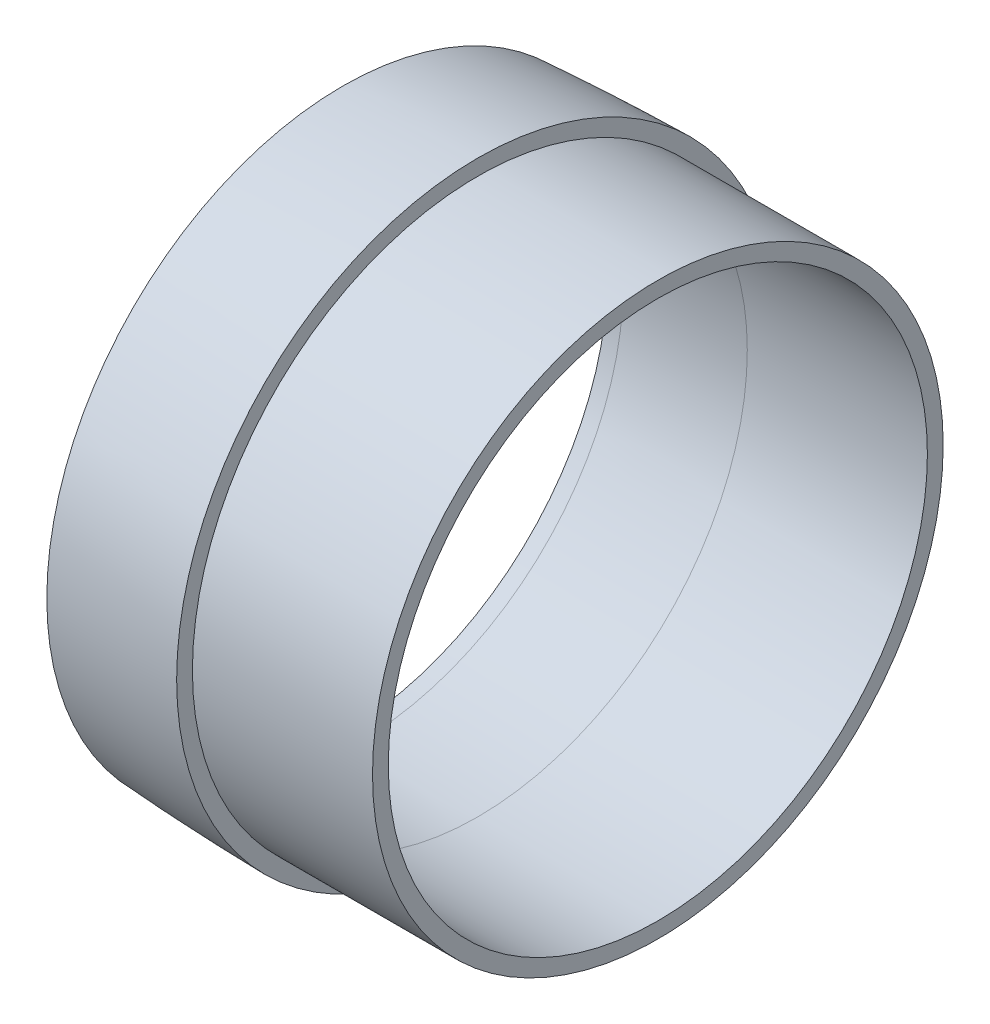
ISO-10303-21;
HEADER;
FILE_DESCRIPTION(('STEP AP214'),'2;1');
FILE_NAME('part.step','',(''),(''),'','','');
FILE_SCHEMA(('AUTOMOTIVE_DESIGN { 1 0 10303 214 1 1 1 1 }'));
ENDSEC;
DATA;
#1=APPLICATION_CONTEXT('core data for automotive mechanical design processes');
#2=APPLICATION_PROTOCOL_DEFINITION('international standard','automotive_design',2000,#1);
#3=PRODUCT_CONTEXT('',#1,'mechanical');
#4=PRODUCT('Part','Part','',(#3));
#5=PRODUCT_RELATED_PRODUCT_CATEGORY('part','',(#4));
#6=PRODUCT_DEFINITION_FORMATION('','',#4);
#7=PRODUCT_DEFINITION_CONTEXT('part definition',#1,'design');
#8=PRODUCT_DEFINITION('design','',#6,#7);
#9=PRODUCT_DEFINITION_SHAPE('','',#8);
#10=(LENGTH_UNIT() NAMED_UNIT(*) SI_UNIT(.MILLI.,.METRE.));
#11=(NAMED_UNIT(*) PLANE_ANGLE_UNIT() SI_UNIT($,.RADIAN.));
#12=(NAMED_UNIT(*) SI_UNIT($,.STERADIAN.) SOLID_ANGLE_UNIT());
#13=UNCERTAINTY_MEASURE_WITH_UNIT(LENGTH_MEASURE(1.E-05),#10,'distance_accuracy_value','');
#14=(GEOMETRIC_REPRESENTATION_CONTEXT(3) GLOBAL_UNCERTAINTY_ASSIGNED_CONTEXT((#13)) GLOBAL_UNIT_ASSIGNED_CONTEXT((#10,
#11,#12)) REPRESENTATION_CONTEXT('',''));
#15=CARTESIAN_POINT('',(0.,0.,0.));
#16=DIRECTION('',(0.,0.,1.));
#17=DIRECTION('',(1.,0.,0.));
#18=AXIS2_PLACEMENT_3D('',#15,#16,#17);
#19=CARTESIAN_POINT('',(185.,0.,0.));
#20=DIRECTION('',(-1.,0.,0.));
#21=DIRECTION('',(0.,0.,1.));
#22=AXIS2_PLACEMENT_3D('',#19,#20,#21);
#23=PLANE('',#22);
#24=CARTESIAN_POINT('',(185.,0.,0.));
#25=DIRECTION('',(-1.,0.,0.));
#26=DIRECTION('',(0.,0.,1.));
#27=AXIS2_PLACEMENT_3D('',#24,#25,#26);
#28=CIRCLE('',#27,29.4153903796707);
#29=CARTESIAN_POINT('',(185.,0.,29.4153903796707));
#30=VERTEX_POINT('',#29);
#31=EDGE_CURVE('E57',#30,#30,#28,.T.);
#32=ORIENTED_EDGE('',*,*,#31,.F.);
#33=EDGE_LOOP('',(#32));
#34=FACE_BOUND('',#33,.T.);
#35=CARTESIAN_POINT('',(185.,0.,0.));
#36=DIRECTION('',(-1.,0.,0.));
#37=DIRECTION('',(0.,0.,1.));
#38=AXIS2_PLACEMENT_3D('',#35,#36,#37);
#39=CIRCLE('',#38,31.0982084339819);
#40=CARTESIAN_POINT('',(185.,0.,31.0982084339819));
#41=VERTEX_POINT('',#40);
#42=EDGE_CURVE('E12',#41,#41,#39,.T.);
#43=ORIENTED_EDGE('',*,*,#42,.T.);
#44=EDGE_LOOP('',(#43));
#45=FACE_BOUND('',#44,.T.);
#46=ADVANCED_FACE('F43',(#34,#45),#23,.T.);
#47=CARTESIAN_POINT('',(185.,0.,0.));
#48=DIRECTION('',(1.,0.,0.));
#49=DIRECTION('',(0.,0.,-1.));
#50=AXIS2_PLACEMENT_3D('',#47,#48,#49);
#51=CONICAL_SURFACE('',#50,31.0982084339819,0.0391359924158488);
#52=CARTESIAN_POINT('',(200.,0.,0.));
#53=DIRECTION('',(1.,0.,0.));
#54=DIRECTION('',(0.,0.,-1.));
#55=AXIS2_PLACEMENT_3D('',#52,#53,#54);
#56=CIRCLE('',#55,31.6855482124485);
#57=CARTESIAN_POINT('',(200.,0.,-31.6855482124485));
#58=VERTEX_POINT('',#57);
#59=EDGE_CURVE('E47',#58,#58,#56,.T.);
#60=ORIENTED_EDGE('',*,*,#59,.F.);
#61=EDGE_LOOP('',(#60));
#62=FACE_BOUND('',#61,.T.);
#63=ORIENTED_EDGE('',*,*,#42,.F.);
#64=EDGE_LOOP('',(#63));
#65=FACE_BOUND('',#64,.T.);
#66=ADVANCED_FACE('F92',(#62,#65),#51,.T.);
#67=CARTESIAN_POINT('',(185.068470505071,0.,0.));
#68=DIRECTION('',(1.,0.,0.));
#69=DIRECTION('',(0.,0.,-1.));
#70=AXIS2_PLACEMENT_3D('',#67,#68,#69);
#71=CONICAL_SURFACE('',#70,29.3495484356016,0.0391359924158488);
#72=CARTESIAN_POINT('',(200.,0.,0.));
#73=DIRECTION('',(1.,0.,0.));
#74=DIRECTION('',(0.,0.,-1.));
#75=AXIS2_PLACEMENT_3D('',#72,#73,#74);
#76=CIRCLE('',#75,29.9342071839829);
#77=CARTESIAN_POINT('',(200.,0.,-29.9342071839829));
#78=VERTEX_POINT('',#77);
#79=EDGE_CURVE('E125',#78,#78,#76,.T.);
#80=ORIENTED_EDGE('',*,*,#79,.T.);
#81=EDGE_LOOP('',(#80));
#82=FACE_BOUND('',#81,.T.);
#83=CARTESIAN_POINT('',(186.75,0.,0.));
#84=DIRECTION('',(1.,0.,0.));
#85=DIRECTION('',(0.,0.,-1.));
#86=AXIS2_PLACEMENT_3D('',#83,#84,#85);
#87=CIRCLE('',#86,29.4153903796707);
#88=CARTESIAN_POINT('',(186.75,0.,-29.4153903796707));
#89=VERTEX_POINT('',#88);
#90=EDGE_CURVE('E66',#89,#89,#87,.T.);
#91=ORIENTED_EDGE('',*,*,#90,.F.);
#92=EDGE_LOOP('',(#91));
#93=FACE_BOUND('',#92,.T.);
#94=ADVANCED_FACE('F89',(#82,#93),#71,.F.);
#95=CARTESIAN_POINT('',(176.75,0.,0.));
#96=DIRECTION('',(1.,0.,0.));
#97=DIRECTION('',(0.,0.,-1.));
#98=AXIS2_PLACEMENT_3D('',#95,#96,#97);
#99=CYLINDRICAL_SURFACE('',#98,29.4153903796707);
#100=ORIENTED_EDGE('',*,*,#31,.T.);
#101=EDGE_LOOP('',(#100));
#102=FACE_BOUND('',#101,.T.);
#103=ORIENTED_EDGE('',*,*,#90,.T.);
#104=EDGE_LOOP('',(#103));
#105=FACE_BOUND('',#104,.T.);
#106=ADVANCED_FACE('F86',(#102,#105),#99,.F.);
#107=CARTESIAN_POINT('',(220.,0.,0.));
#108=DIRECTION('',(1.,0.,0.));
#109=DIRECTION('',(0.,0.,-1.));
#110=AXIS2_PLACEMENT_3D('',#107,#108,#109);
#111=PLANE('',#110);
#112=CARTESIAN_POINT('',(220.,0.,0.));
#113=DIRECTION('',(1.,0.,0.));
#114=DIRECTION('',(0.,0.,-1.));
#115=AXIS2_PLACEMENT_3D('',#112,#113,#114);
#116=CIRCLE('',#115,31.6855482124485);
#117=CARTESIAN_POINT('',(220.,0.,-31.6855482124485));
#118=VERTEX_POINT('',#117);
#119=EDGE_CURVE('E121',#118,#118,#116,.T.);
#120=ORIENTED_EDGE('',*,*,#119,.T.);
#121=EDGE_LOOP('',(#120));
#122=FACE_BOUND('',#121,.T.);
#123=CARTESIAN_POINT('',(220.,0.,0.));
#124=DIRECTION('',(1.,0.,0.));
#125=DIRECTION('',(0.,0.,-1.));
#126=AXIS2_PLACEMENT_3D('',#123,#124,#125);
#127=CIRCLE('',#126,29.9342071839829);
#128=CARTESIAN_POINT('',(220.,0.,-29.9342071839829));
#129=VERTEX_POINT('',#128);
#130=EDGE_CURVE('E124',#129,#129,#127,.T.);
#131=ORIENTED_EDGE('',*,*,#130,.F.);
#132=EDGE_LOOP('',(#131));
#133=FACE_BOUND('',#132,.T.);
#134=ADVANCED_FACE('F83',(#122,#133),#111,.T.);
#135=CARTESIAN_POINT('',(220.,0.,0.));
#136=DIRECTION('',(-1.,0.,0.));
#137=DIRECTION('',(0.,0.,1.));
#138=AXIS2_PLACEMENT_3D('',#135,#136,#137);
#139=CYLINDRICAL_SURFACE('',#138,31.6855482124485);
#140=ORIENTED_EDGE('',*,*,#119,.F.);
#141=EDGE_LOOP('',(#140));
#142=FACE_BOUND('',#141,.T.);
#143=ORIENTED_EDGE('',*,*,#59,.T.);
#144=EDGE_LOOP('',(#143));
#145=FACE_BOUND('',#144,.T.);
#146=ADVANCED_FACE('F72',(#142,#145),#139,.T.);
#147=CARTESIAN_POINT('',(220.,0.,0.));
#148=DIRECTION('',(-1.,0.,0.));
#149=DIRECTION('',(0.,0.,1.));
#150=AXIS2_PLACEMENT_3D('',#147,#148,#149);
#151=CYLINDRICAL_SURFACE('',#150,29.9342071839829);
#152=ORIENTED_EDGE('',*,*,#130,.T.);
#153=EDGE_LOOP('',(#152));
#154=FACE_BOUND('',#153,.T.);
#155=ORIENTED_EDGE('',*,*,#79,.F.);
#156=EDGE_LOOP('',(#155));
#157=FACE_BOUND('',#156,.T.);
#158=ADVANCED_FACE('F82',(#154,#157),#151,.F.);
#159=CLOSED_SHELL('',(#46,#66,#94,#106,#134,#146,#158));
#160=MANIFOLD_SOLID_BREP('B2',#159);
#161=CARTESIAN_POINT('',(200.,33.4355685150698,0.));
#162=CARTESIAN_POINT('',(199.322179654003,33.4323383643763,0.));
#163=CARTESIAN_POINT('',(197.96668201448,33.4109822420062,0.));
#164=CARTESIAN_POINT('',(193.575946740602,33.2950534490437,0.));
#165=CARTESIAN_POINT('',(186.154623569186,32.9539645763986,0.));
#166=CARTESIAN_POINT('',(176.386553472775,32.3323949245245,0.));
#167=CARTESIAN_POINT('',(164.280072944056,31.3478971261456,0.));
#168=CARTESIAN_POINT('',(152.189147407201,30.1899129927248,0.));
#169=CARTESIAN_POINT('',(140.114018126728,28.8775873685312,0.));
#170=CARTESIAN_POINT('',(128.05522623978,27.4232989862083,0.));
#171=CARTESIAN_POINT('',(116.013631476871,25.8328412652977,0.));
#172=CARTESIAN_POINT('',(103.990482125065,24.1085760118513,0.));
#173=CARTESIAN_POINT('',(91.9875106556967,22.248884905431,0.));
#174=CARTESIAN_POINT('',(80.0071383039936,20.2486418789882,0.));
#175=CARTESIAN_POINT('',(68.052752748457,18.0981923642982,0.));
#176=CARTESIAN_POINT('',(56.1293217805533,15.7818096250316,0.));
#177=CARTESIAN_POINT('',(44.2443671822434,13.2745922542246,0.));
#178=CARTESIAN_POINT('',(33.2254451342742,10.7238520935605,0.));
#179=CARTESIAN_POINT('',(23.7399008996518,8.29191144076045,0.));
#180=CARTESIAN_POINT('',(16.1615279538934,6.12216645315078,0.));
#181=CARTESIAN_POINT('',(10.7984161562651,4.41093759935858,0.));
#182=CARTESIAN_POINT('',(7.06503905609062,3.08569859262728,0.));
#183=CARTESIAN_POINT('',(4.42378862410607,2.04005703667645,0.));
#184=CARTESIAN_POINT('',(2.70977796726177,1.28363377804088,0.));
#185=CARTESIAN_POINT('',(1.58549241696781,0.737587827803518,0.));
#186=CARTESIAN_POINT('',(0.90429535730028,0.386360833356651,0.));
#187=CARTESIAN_POINT('',(0.549478166428491,0.203997996855062,0.));
#188=CARTESIAN_POINT('',(0.304588775814575,0.0914897913141497,0.));
#189=CARTESIAN_POINT('',(0.175151488046642,0.0408399449586508,0.));
#190=CARTESIAN_POINT('',(0.0889645538634368,0.0127715996474495,0.));
#191=CARTESIAN_POINT('',(0.0297309525910866,0.00266548567570939,0.));
#192=CARTESIAN_POINT('',(0.,0.,0.));
#193=B_SPLINE_CURVE_WITH_KNOTS('',4,(#161,#162,#163,#164,#165,#166,#167,#168,#169,#170,#171,
#172,#173,#174,#175,#176,#177,#178,#179,#180,#181,#182,#183,#184,#185,#186,#187,#188,#189,#190,
#191,#192),.UNSPECIFIED.,.F.,.F.,(5,1,1,1,1,1,1,1,1,1,1,1,1,1,1,1,1,1,1,1,1,1,1,1,1,1,1,1,5),
(0.,0.0133209642117482,0.0266419284234964,0.0863167691697009,0.145991610068889,
0.205666451663834,0.265341292558525,0.325016131418618,0.384690973552768,0.444365812322199,
0.50404065606741,0.563715493321218,0.623390332433378,0.683065171883309,0.742740011906119,
0.802414855634365,0.862089687624013,0.905325029529881,0.935162430760937,0.957312634774657,
0.972707485547451,0.983165991718057,0.990977432175115,0.994122067130278,0.997266702085442,
0.998227464598054,0.998817984622571,0.999415053510214,1.),.UNSPECIFIED.);
#194=CARTESIAN_POINT('',(200.,0.,0.));
#195=DIRECTION('',(1.,0.,0.));
#196=AXIS1_PLACEMENT('',#194,#195);
#197=SURFACE_OF_REVOLUTION('',#193,#196);
#198=CARTESIAN_POINT('',(185.,0.,0.));
#199=DIRECTION('',(1.,0.,0.));
#200=DIRECTION('',(0.,0.,-1.));
#201=AXIS2_PLACEMENT_3D('',#198,#199,#200);
#202=CIRCLE('',#201,32.8511651161733);
#203=CARTESIAN_POINT('',(185.,0.,-32.8511651161733));
#204=VERTEX_POINT('',#203);
#205=EDGE_CURVE('E206',#204,#204,#202,.F.);
#206=ORIENTED_EDGE('',*,*,#205,.F.);
#207=EDGE_LOOP('',(#206));
#208=FACE_BOUND('',#207,.T.);
#209=CARTESIAN_POINT('',(200.,0.,0.));
#210=DIRECTION('',(1.,0.,0.));
#211=DIRECTION('',(0.,0.,-1.));
#212=AXIS2_PLACEMENT_3D('',#209,#210,#211);
#213=CIRCLE('',#212,33.4355685150698);
#214=CARTESIAN_POINT('',(200.,0.,-33.4355685150698));
#215=VERTEX_POINT('',#214);
#216=EDGE_CURVE('E42',#215,#215,#213,.T.);
#217=ORIENTED_EDGE('',*,*,#216,.F.);
#218=EDGE_LOOP('',(#217));
#219=FACE_BOUND('',#218,.T.);
#220=ADVANCED_FACE('F194',(#208,#219),#197,.F.);
#221=CARTESIAN_POINT('',(200.,33.4355685150698,0.));
#222=DIRECTION('',(1.,0.,0.));
#223=DIRECTION('',(0.,0.,-1.));
#224=AXIS2_PLACEMENT_3D('',#221,#222,#223);
#225=PLANE('',#224);
#226=CARTESIAN_POINT('',(200.,0.,0.));
#227=DIRECTION('',(1.,0.,0.));
#228=DIRECTION('',(0.,0.,-1.));
#229=AXIS2_PLACEMENT_3D('',#226,#227,#228);
#230=CIRCLE('',#229,31.6855482124485);
#231=CARTESIAN_POINT('',(200.,0.,-31.6855482124485));
#232=VERTEX_POINT('',#231);
#233=EDGE_CURVE('E202',#232,#232,#230,.T.);
#234=ORIENTED_EDGE('',*,*,#233,.F.);
#235=EDGE_LOOP('',(#234));
#236=FACE_BOUND('',#235,.T.);
#237=ORIENTED_EDGE('',*,*,#216,.T.);
#238=EDGE_LOOP('',(#237));
#239=FACE_BOUND('',#238,.T.);
#240=ADVANCED_FACE('F227',(#236,#239),#225,.T.);
#241=CARTESIAN_POINT('',(200.,33.4355685150698,0.));
#242=CARTESIAN_POINT('',(199.322179654003,33.4323383643763,0.));
#243=CARTESIAN_POINT('',(197.96668201448,33.4109822420062,0.));
#244=CARTESIAN_POINT('',(193.575946740602,33.2950534490437,0.));
#245=CARTESIAN_POINT('',(186.154623569186,32.9539645763986,0.));
#246=CARTESIAN_POINT('',(176.386553472775,32.3323949245245,0.));
#247=CARTESIAN_POINT('',(164.280072944056,31.3478971261456,0.));
#248=CARTESIAN_POINT('',(152.189147407201,30.1899129927248,0.));
#249=CARTESIAN_POINT('',(140.114018126728,28.8775873685312,0.));
#250=CARTESIAN_POINT('',(128.05522623978,27.4232989862083,0.));
#251=CARTESIAN_POINT('',(116.013631476871,25.8328412652977,0.));
#252=CARTESIAN_POINT('',(103.990482125065,24.1085760118513,0.));
#253=CARTESIAN_POINT('',(91.9875106556967,22.248884905431,0.));
#254=CARTESIAN_POINT('',(80.0071383039936,20.2486418789882,0.));
#255=CARTESIAN_POINT('',(68.052752748457,18.0981923642982,0.));
#256=CARTESIAN_POINT('',(56.1293217805533,15.7818096250316,0.));
#257=CARTESIAN_POINT('',(44.2443671822434,13.2745922542246,0.));
#258=CARTESIAN_POINT('',(33.2254451342742,10.7238520935605,0.));
#259=CARTESIAN_POINT('',(23.7399008996518,8.29191144076045,0.));
#260=CARTESIAN_POINT('',(16.1615279538934,6.12216645315078,0.));
#261=CARTESIAN_POINT('',(10.7984161562651,4.41093759935858,0.));
#262=CARTESIAN_POINT('',(7.15446609725211,3.11744256062833,0.));
#263=CARTESIAN_POINT('',(4.96995131345689,2.25613461671395,0.));
#264=CARTESIAN_POINT('',(3.84672985171564,1.7780436069638,0.));
#265=CARTESIAN_POINT('',(3.44639537802266,1.60209691594584,0.));
#266=B_SPLINE_CURVE_WITH_KNOTS('',4,(#241,#242,#243,#244,#245,#246,#247,#248,#249,#250,#251,
#252,#253,#254,#255,#256,#257,#258,#259,#260,#261,#262,#263,#264,#265),.UNSPECIFIED.,.F.,.F.,(5,
1,1,1,1,1,1,1,1,1,1,1,1,1,1,1,1,1,1,1,1,5),(0.,0.0133209642117482,0.0266419284234964,
0.0863167691697009,0.145991610068889,0.205666451663834,0.265341292558525,0.325016131418618,
0.384690973552768,0.444365812322199,0.50404065606741,0.563715493321218,0.623390332433378,
0.683065171883309,0.742740011906119,0.802414855634365,0.862089687624013,0.905325029529881,
0.935162430760937,0.957312634774657,0.972707485547451,0.981301436720565),.UNSPECIFIED.);
#267=CARTESIAN_POINT('',(200.,0.,0.));
#268=DIRECTION('',(1.,0.,0.));
#269=AXIS1_PLACEMENT('',#267,#268);
#270=SURFACE_OF_REVOLUTION('',#266,#269);
#271=OFFSET_SURFACE('',#270,1.75,.F.);
#272=CARTESIAN_POINT('',(185.,0.,0.));
#273=DIRECTION('',(1.,0.,0.));
#274=DIRECTION('',(0.,0.,-1.));
#275=AXIS2_PLACEMENT_3D('',#272,#273,#274);
#276=CIRCLE('',#275,31.0982084339819);
#277=CARTESIAN_POINT('',(185.,0.,-31.0982084339819));
#278=VERTEX_POINT('',#277);
#279=EDGE_CURVE('E198',#278,#278,#276,.F.);
#280=ORIENTED_EDGE('',*,*,#279,.T.);
#281=EDGE_LOOP('',(#280));
#282=FACE_BOUND('',#281,.T.);
#283=ORIENTED_EDGE('',*,*,#233,.T.);
#284=EDGE_LOOP('',(#283));
#285=FACE_BOUND('',#284,.T.);
#286=ADVANCED_FACE('F225',(#282,#285),#271,.T.);
#287=CARTESIAN_POINT('',(185.,0.,0.));
#288=DIRECTION('',(1.,0.,0.));
#289=DIRECTION('',(0.,0.,-1.));
#290=AXIS2_PLACEMENT_3D('',#287,#288,#289);
#291=PLANE('',#290);
#292=ORIENTED_EDGE('',*,*,#205,.T.);
#293=EDGE_LOOP('',(#292));
#294=FACE_BOUND('',#293,.T.);
#295=ORIENTED_EDGE('',*,*,#279,.F.);
#296=EDGE_LOOP('',(#295));
#297=FACE_BOUND('',#296,.T.);
#298=ADVANCED_FACE('F234',(#294,#297),#291,.F.);
#299=CLOSED_SHELL('',(#220,#240,#286,#298));
#300=MANIFOLD_SOLID_BREP('B7_NOT_SHOWN',#299);
#301=ADVANCED_BREP_SHAPE_REPRESENTATION('',(#18,#160,#300),#14);
#302=SHAPE_DEFINITION_REPRESENTATION(#9,#301);
ENDSEC;
END-ISO-10303-21;
